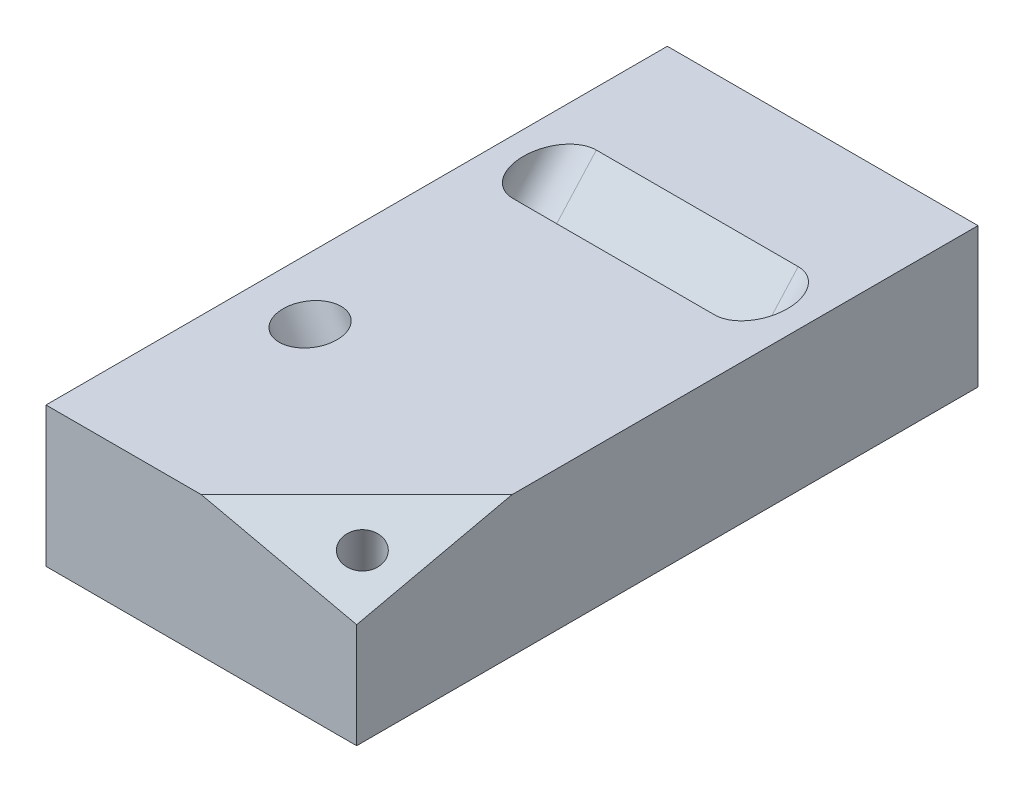
ISO-10303-21;
HEADER;
FILE_DESCRIPTION(('STEP AP214'),'2;1');
FILE_NAME('part.step','',(''),(''),'','','');
FILE_SCHEMA(('AUTOMOTIVE_DESIGN { 1 0 10303 214 1 1 1 1 }'));
ENDSEC;
DATA;
#1=APPLICATION_CONTEXT('core data for automotive mechanical design processes');
#2=APPLICATION_PROTOCOL_DEFINITION('international standard','automotive_design',2000,#1);
#3=PRODUCT_CONTEXT('',#1,'mechanical');
#4=PRODUCT('Part','Part','',(#3));
#5=PRODUCT_RELATED_PRODUCT_CATEGORY('part','',(#4));
#6=PRODUCT_DEFINITION_FORMATION('','',#4);
#7=PRODUCT_DEFINITION_CONTEXT('part definition',#1,'design');
#8=PRODUCT_DEFINITION('design','',#6,#7);
#9=PRODUCT_DEFINITION_SHAPE('','',#8);
#10=(LENGTH_UNIT() NAMED_UNIT(*) SI_UNIT(.MILLI.,.METRE.));
#11=(NAMED_UNIT(*) PLANE_ANGLE_UNIT() SI_UNIT($,.RADIAN.));
#12=(NAMED_UNIT(*) SI_UNIT($,.STERADIAN.) SOLID_ANGLE_UNIT());
#13=UNCERTAINTY_MEASURE_WITH_UNIT(LENGTH_MEASURE(1.E-05),#10,'distance_accuracy_value','');
#14=(GEOMETRIC_REPRESENTATION_CONTEXT(3) GLOBAL_UNCERTAINTY_ASSIGNED_CONTEXT((#13)) GLOBAL_UNIT_ASSIGNED_CONTEXT((#10,
#11,#12)) REPRESENTATION_CONTEXT('',''));
#15=CARTESIAN_POINT('',(0.,0.,0.));
#16=DIRECTION('',(0.,0.,1.));
#17=DIRECTION('',(1.,0.,0.));
#18=AXIS2_PLACEMENT_3D('',#15,#16,#17);
#19=CARTESIAN_POINT('',(100.,90.,200.));
#20=DIRECTION('',(-1.,0.,0.));
#21=DIRECTION('',(0.,0.,1.));
#22=AXIS2_PLACEMENT_3D('',#19,#20,#21);
#23=PLANE('',#22);
#24=DIRECTION('',(0.,-0.219512195121951,0.975609756097561));
#25=VECTOR('',#24,1.);
#26=CARTESIAN_POINT('',(99.9999999999999,90.0000000000001,100.));
#27=LINE('',#26,#25);
#28=CARTESIAN_POINT('',(100.,90.,100.));
#29=VERTEX_POINT('',#28);
#30=CARTESIAN_POINT('',(100.,67.5,200.));
#31=VERTEX_POINT('',#30);
#32=EDGE_CURVE('E170',#29,#31,#27,.T.);
#33=ORIENTED_EDGE('',*,*,#32,.T.);
#34=DIRECTION('',(0.,-1.,0.));
#35=VECTOR('',#34,1.);
#36=CARTESIAN_POINT('',(100.,90.,200.));
#37=LINE('',#36,#35);
#38=CARTESIAN_POINT('',(100.,0.,200.));
#39=VERTEX_POINT('',#38);
#40=EDGE_CURVE('E184',#31,#39,#37,.T.);
#41=ORIENTED_EDGE('',*,*,#40,.T.);
#42=DIRECTION('',(0.,0.,-1.));
#43=VECTOR('',#42,1.);
#44=CARTESIAN_POINT('',(100.,0.,200.));
#45=LINE('',#44,#43);
#46=CARTESIAN_POINT('',(100.,0.,-200.));
#47=VERTEX_POINT('',#46);
#48=EDGE_CURVE('E173',#39,#47,#45,.T.);
#49=ORIENTED_EDGE('',*,*,#48,.T.);
#50=DIRECTION('',(0.,-1.,0.));
#51=VECTOR('',#50,1.);
#52=CARTESIAN_POINT('',(100.,90.,-200.));
#53=LINE('',#52,#51);
#54=CARTESIAN_POINT('',(100.,90.,-200.));
#55=VERTEX_POINT('',#54);
#56=EDGE_CURVE('E111',#55,#47,#53,.T.);
#57=ORIENTED_EDGE('',*,*,#56,.F.);
#58=DIRECTION('',(0.,0.,-1.));
#59=VECTOR('',#58,1.);
#60=CARTESIAN_POINT('',(100.,90.,200.));
#61=LINE('',#60,#59);
#62=EDGE_CURVE('E174',#29,#55,#61,.T.);
#63=ORIENTED_EDGE('',*,*,#62,.F.);
#64=EDGE_LOOP('',(#33,#41,#49,#57,#63));
#65=FACE_BOUND('',#64,.T.);
#66=ADVANCED_FACE('F39',(#65),#23,.F.);
#67=CARTESIAN_POINT('',(-100.,90.,200.));
#68=DIRECTION('',(0.,0.,-1.));
#69=DIRECTION('',(-1.,0.,0.));
#70=AXIS2_PLACEMENT_3D('',#67,#68,#69);
#71=PLANE('',#70);
#72=DIRECTION('',(-0.975609756097561,0.219512195121951,0.));
#73=VECTOR('',#72,1.);
#74=CARTESIAN_POINT('',(100.,67.5,200.));
#75=LINE('',#74,#73);
#76=CARTESIAN_POINT('',(0.,90.,200.));
#77=VERTEX_POINT('',#76);
#78=EDGE_CURVE('E164',#31,#77,#75,.T.);
#79=ORIENTED_EDGE('',*,*,#78,.T.);
#80=DIRECTION('',(1.,0.,0.));
#81=VECTOR('',#80,1.);
#82=CARTESIAN_POINT('',(-100.,90.,200.));
#83=LINE('',#82,#81);
#84=CARTESIAN_POINT('',(-100.,90.,200.));
#85=VERTEX_POINT('',#84);
#86=EDGE_CURVE('E181',#85,#77,#83,.T.);
#87=ORIENTED_EDGE('',*,*,#86,.F.);
#88=DIRECTION('',(0.,-1.,0.));
#89=VECTOR('',#88,1.);
#90=CARTESIAN_POINT('',(-100.,90.,200.));
#91=LINE('',#90,#89);
#92=CARTESIAN_POINT('',(-100.,0.,200.));
#93=VERTEX_POINT('',#92);
#94=EDGE_CURVE('E194',#85,#93,#91,.T.);
#95=ORIENTED_EDGE('',*,*,#94,.T.);
#96=DIRECTION('',(1.,0.,0.));
#97=VECTOR('',#96,1.);
#98=CARTESIAN_POINT('',(-100.,0.,200.));
#99=LINE('',#98,#97);
#100=EDGE_CURVE('E177',#93,#39,#99,.T.);
#101=ORIENTED_EDGE('',*,*,#100,.T.);
#102=ORIENTED_EDGE('',*,*,#40,.F.);
#103=EDGE_LOOP('',(#79,#87,#95,#101,#102));
#104=FACE_BOUND('',#103,.T.);
#105=ADVANCED_FACE('F217',(#104),#71,.F.);
#106=CARTESIAN_POINT('',(0.,90.,0.));
#107=DIRECTION('',(0.,-1.,0.));
#108=DIRECTION('',(0.,0.,-1.));
#109=AXIS2_PLACEMENT_3D('',#106,#107,#108);
#110=PLANE('',#109);
#111=DIRECTION('',(1.,0.,0.));
#112=VECTOR('',#111,1.);
#113=CARTESIAN_POINT('',(0.,90.,-119.262036223617));
#114=LINE('',#113,#112);
#115=CARTESIAN_POINT('',(-65.,90.,-119.262036223617));
#116=VERTEX_POINT('',#115);
#117=CARTESIAN_POINT('',(65.,90.,-119.262036223617));
#118=VERTEX_POINT('',#117);
#119=EDGE_CURVE('E334',#116,#118,#114,.T.);
#120=ORIENTED_EDGE('',*,*,#119,.T.);
#121=CARTESIAN_POINT('',(65.,90.,-92.3493816314897));
#122=DIRECTION('',(0.,-1.,0.));
#123=DIRECTION('',(0.,0.,-1.));
#124=AXIS2_PLACEMENT_3D('',#121,#122,#123);
#125=ELLIPSE('',#124,26.9126545921276,20.);
#126=CARTESIAN_POINT('',(65.,90.,-65.4367270393622));
#127=VERTEX_POINT('',#126);
#128=EDGE_CURVE('E118',#118,#127,#125,.T.);
#129=ORIENTED_EDGE('',*,*,#128,.T.);
#130=DIRECTION('',(1.,0.,0.));
#131=VECTOR('',#130,1.);
#132=CARTESIAN_POINT('',(0.,90.,-65.4367270393622));
#133=LINE('',#132,#131);
#134=CARTESIAN_POINT('',(-65.,90.,-65.4367270393622));
#135=VERTEX_POINT('',#134);
#136=EDGE_CURVE('E339',#135,#127,#133,.T.);
#137=ORIENTED_EDGE('',*,*,#136,.F.);
#138=CARTESIAN_POINT('',(-65.,90.,-92.3493816314897));
#139=DIRECTION('',(0.,-1.,0.));
#140=DIRECTION('',(0.,0.,-1.));
#141=AXIS2_PLACEMENT_3D('',#138,#139,#140);
#142=ELLIPSE('',#141,26.9126545921276,20.);
#143=EDGE_CURVE('E330',#135,#116,#142,.T.);
#144=ORIENTED_EDGE('',*,*,#143,.T.);
#145=EDGE_LOOP('',(#120,#129,#137,#144));
#146=FACE_BOUND('',#145,.T.);
#147=CARTESIAN_POINT('',(-60.0000000000001,90.,50.));
#148=CARTESIAN_POINT('',(-59.7652053283955,90.,49.9999988452972));
#149=CARTESIAN_POINT('',(-59.5304306376043,90.,50.0055146076062));
#150=CARTESIAN_POINT('',(-59.0615251413032,90.,50.0275421938246));
#151=CARTESIAN_POINT('',(-58.827394063033,90.,50.0440482590427));
#152=CARTESIAN_POINT('',(-58.1742145812687,90.,50.1054922984556));
#153=CARTESIAN_POINT('',(-57.7562494179976,90.,50.1626027392273));
#154=CARTESIAN_POINT('',(-56.9263661175837,90.,50.311449284218));
#155=CARTESIAN_POINT('',(-56.514451274401,90.,50.4032035728577));
#156=CARTESIAN_POINT('',(-55.6947360998138,90.,50.6215348289774));
#157=CARTESIAN_POINT('',(-55.2870419531278,90.,50.7485105850292));
#158=CARTESIAN_POINT('',(-54.4833749418192,90.,51.0353387366216));
#159=CARTESIAN_POINT('',(-54.0874030686239,90.,51.1951939039475));
#160=CARTESIAN_POINT('',(-53.3089152512236,90.,51.5462999780631));
#161=CARTESIAN_POINT('',(-52.9264210727341,90.,51.7375990751777));
#162=CARTESIAN_POINT('',(-52.1775383867728,90.,52.1494673927575));
#163=CARTESIAN_POINT('',(-51.8111506781314,90.,52.3700380628252));
#164=CARTESIAN_POINT('',(-51.077908684671,90.,52.850348140272));
#165=CARTESIAN_POINT('',(-50.7119891563375,90.,53.111513959563));
#166=CARTESIAN_POINT('',(-50.001474934222,90.,53.661398042464));
#167=CARTESIAN_POINT('',(-49.6568818199419,90.,53.9501183428303));
#168=CARTESIAN_POINT('',(-48.9906809685199,90.,54.5522960289209));
#169=CARTESIAN_POINT('',(-48.6690510126073,90.,54.8657288677396));
#170=CARTESIAN_POINT('',(-48.0495002435389,90.,55.5150398933948));
#171=CARTESIAN_POINT('',(-47.7515744548936,90.,55.8509133425873));
#172=CARTESIAN_POINT('',(-47.1498502478439,90.,56.579455112673));
#173=CARTESIAN_POINT('',(-46.8487716314138,90.,56.9743711201159));
#174=CARTESIAN_POINT('',(-46.277282999022,90.,57.7856853967356));
#175=CARTESIAN_POINT('',(-46.0068695555349,90.,58.2020812574695));
#176=CARTESIAN_POINT('',(-45.4948454912646,90.,59.0574182573282));
#177=CARTESIAN_POINT('',(-45.253523096637,90.,59.4965317244831));
#178=CARTESIAN_POINT('',(-44.8028969813265,90.,60.3910501717807));
#179=CARTESIAN_POINT('',(-44.5936041903744,90.,60.8464606479712));
#180=CARTESIAN_POINT('',(-44.2072634663421,90.,61.771013985322));
#181=CARTESIAN_POINT('',(-44.0302318749787,90.,62.240163667113));
#182=CARTESIAN_POINT('',(-43.7086675069423,90.,63.189483469836));
#183=CARTESIAN_POINT('',(-43.5641375067785,90.,63.6696545284312));
#184=CARTESIAN_POINT('',(-43.2840661028775,90.,64.727765472262));
#185=CARTESIAN_POINT('',(-43.1550655241902,90.,65.3074461254432));
#186=CARTESIAN_POINT('',(-42.9428868136613,90.,66.4745926962538));
#187=CARTESIAN_POINT('',(-42.8596704965388,90.,67.0620517064322));
#188=CARTESIAN_POINT('',(-42.7388871794467,90.,68.2417418768135));
#189=CARTESIAN_POINT('',(-42.7013279339652,90.,68.8339738304734));
#190=CARTESIAN_POINT('',(-42.6718841854332,90.,70.0196922533776));
#191=CARTESIAN_POINT('',(-42.6800092424899,90.,70.6131789592206));
#192=CARTESIAN_POINT('',(-42.7419544708201,90.,71.7977424571735));
#193=CARTESIAN_POINT('',(-42.7957726863146,90.,72.3888193513413));
#194=CARTESIAN_POINT('',(-42.949095882727,90.,73.5649996637939));
#195=CARTESIAN_POINT('',(-43.0485985763027,90.,74.1501033796463));
#196=CARTESIAN_POINT('',(-43.2932814374751,90.,75.3107604988306));
#197=CARTESIAN_POINT('',(-43.4384661638352,90.,75.8863129429719));
#198=CARTESIAN_POINT('',(-43.7744933001938,90.,77.0241465328505));
#199=CARTESIAN_POINT('',(-43.9653490044202,90.,77.5864237618897));
#200=CARTESIAN_POINT('',(-44.3888201874786,90.,78.6838548759501));
#201=CARTESIAN_POINT('',(-44.6206537951476,90.,79.2193100751441));
#202=CARTESIAN_POINT('',(-45.1279208288465,90.,80.2691912430945));
#203=CARTESIAN_POINT('',(-45.4033525335809,90.,80.7836180410642));
#204=CARTESIAN_POINT('',(-45.9777405157709,90.,81.7540351404949));
#205=CARTESIAN_POINT('',(-46.2739618693368,90.,82.2116441308714));
#206=CARTESIAN_POINT('',(-46.9031629483718,90.,83.1006287039279));
#207=CARTESIAN_POINT('',(-47.2361262953167,90.,83.5320158436189));
#208=CARTESIAN_POINT('',(-47.9138103941635,90.,84.3361388994394));
#209=CARTESIAN_POINT('',(-48.2561656242023,90.,84.7108682647113));
#210=CARTESIAN_POINT('',(-48.9707347184547,90.,85.4307072749091));
#211=CARTESIAN_POINT('',(-49.3429458315239,90.,85.7758196429146));
#212=CARTESIAN_POINT('',(-50.0903823151189,90.,86.4114032220766));
#213=CARTESIAN_POINT('',(-50.4638250144253,90.,86.7039706690662));
#214=CARTESIAN_POINT('',(-51.2336546189204,90.,87.257139407959));
#215=CARTESIAN_POINT('',(-51.6300380225035,90.,87.5177455595044));
#216=CARTESIAN_POINT('',(-52.4209586869913,90.,87.9905622749516));
#217=CARTESIAN_POINT('',(-52.8143672358095,90.,88.2046607528793));
#218=CARTESIAN_POINT('',(-53.6175330844787,90.,88.5994453787394));
#219=CARTESIAN_POINT('',(-54.0272864936262,90.,88.7801394211842));
#220=CARTESIAN_POINT('',(-54.8431659464039,90.,89.0992043165133));
#221=CARTESIAN_POINT('',(-55.2487213604421,90.,89.2390341523805));
#222=CARTESIAN_POINT('',(-56.0703468463312,90.,89.4846265433299));
#223=CARTESIAN_POINT('',(-56.4864239340249,90.0000000000001,89.5903656843326));
#224=CARTESIAN_POINT('',(-57.3212893445125,90.0000000000001,89.7653727072141));
#225=CARTESIAN_POINT('',(-57.7399942149525,90.,89.8350383297135));
#226=CARTESIAN_POINT('',(-58.581939356568,90.,89.9388530625604));
#227=CARTESIAN_POINT('',(-59.0051811343312,90.,89.9729899808278));
#228=CARTESIAN_POINT('',(-59.8535748444583,90.,90.0052968321121));
#229=CARTESIAN_POINT('',(-60.2787285178289,90.,90.0034211287037));
#230=CARTESIAN_POINT('',(-61.1272974604698,90.,89.9636168059096));
#231=CARTESIAN_POINT('',(-61.5507129069006,90.,89.925691957137));
#232=CARTESIAN_POINT('',(-62.3914695275698,90.,89.8144506274045));
#233=CARTESIAN_POINT('',(-62.8088258878297,90.,89.7412486818732));
#234=CARTESIAN_POINT('',(-63.6360319309605,90.,89.5603850025502));
#235=CARTESIAN_POINT('',(-64.0458809067137,90.,89.4527200401661));
#236=CARTESIAN_POINT('',(-64.8548735112772,90.,89.2043460854379));
#237=CARTESIAN_POINT('',(-65.254029639864,90.,89.0636777361914));
#238=CARTESIAN_POINT('',(-66.0396431778818,90.,88.750833663402));
#239=CARTESIAN_POINT('',(-66.4261041570811,90.,88.578666887969));
#240=CARTESIAN_POINT('',(-67.1910519234975,90.,88.2012753590861));
#241=CARTESIAN_POINT('',(-67.5692761202084,90.,87.9955189533775));
#242=CARTESIAN_POINT('',(-68.3085079293332,90.,87.5553080166032));
#243=CARTESIAN_POINT('',(-68.6695188195047,90.,87.3208589797591));
#244=CARTESIAN_POINT('',(-69.3762271530275,90.,86.8229753792021));
#245=CARTESIAN_POINT('',(-69.7217409101227,90.,86.5592804266927));
#246=CARTESIAN_POINT('',(-70.3924163300243,90.,86.0069736522419));
#247=CARTESIAN_POINT('',(-70.7175706844407,90.,85.7183529701983));
#248=CARTESIAN_POINT('',(-71.3464990476752,90.,85.118353015349));
#249=CARTESIAN_POINT('',(-71.6502601785092,90.,84.8069602605603));
#250=CARTESIAN_POINT('',(-72.2353608810002,90.,84.1637630443636));
#251=CARTESIAN_POINT('',(-72.5166981884357,90.,83.8319565276766));
#252=CARTESIAN_POINT('',(-73.0980628566826,90.,83.0972801980343));
#253=CARTESIAN_POINT('',(-73.3942422101112,90.,82.6913606623502));
#254=CARTESIAN_POINT('',(-73.9547963648439,90.,81.8587266189492));
#255=CARTESIAN_POINT('',(-74.2192002055038,90.,81.4320316067507));
#256=CARTESIAN_POINT('',(-74.7160152219459,90.,80.5604916128314));
#257=CARTESIAN_POINT('',(-74.9484301924193,90.,80.115648792031));
#258=CARTESIAN_POINT('',(-75.3810442719969,90.,79.2104295740401));
#259=CARTESIAN_POINT('',(-75.5812325653466,90.,78.7500480242672));
#260=CARTESIAN_POINT('',(-75.9927227406751,90.,77.7058082361404));
#261=CARTESIAN_POINT('',(-76.1954176356903,90.,77.1185412713255));
#262=CARTESIAN_POINT('',(-76.550941439348,90.,75.9288578286583));
#263=CARTESIAN_POINT('',(-76.7037457486539,90.,75.3264340346852));
#264=CARTESIAN_POINT('',(-76.9592284205133,90.,74.1113743388705));
#265=CARTESIAN_POINT('',(-77.0619315037063,90.,73.498743627896));
#266=CARTESIAN_POINT('',(-77.2172874383968,90.,72.2672658207651));
#267=CARTESIAN_POINT('',(-77.2699467976985,90.,71.6484195434759));
#268=CARTESIAN_POINT('',(-77.3252374570808,90.,70.4085122745555));
#269=CARTESIAN_POINT('',(-77.3278697125436,90.,69.787451325445));
#270=CARTESIAN_POINT('',(-77.2831083121336,90.,68.5471357426293));
#271=CARTESIAN_POINT('',(-77.2357150643711,90.,67.9278810942296));
#272=CARTESIAN_POINT('',(-77.0908781405753,90.,66.6950070436764));
#273=CARTESIAN_POINT('',(-76.9934157931142,90.,66.081389830749));
#274=CARTESIAN_POINT('',(-76.7485049683716,90.,64.864492622782));
#275=CARTESIAN_POINT('',(-76.6010806560502,90.,64.261207778226));
#276=CARTESIAN_POINT('',(-76.2619099069974,90.,63.0884081703043));
#277=CARTESIAN_POINT('',(-76.0717569012247,90.,62.5184328222461));
#278=CARTESIAN_POINT('',(-75.6448607313489,90.,61.3961217504185));
#279=CARTESIAN_POINT('',(-75.4081157363628,90.,60.8437867208364));
#280=CARTESIAN_POINT('',(-74.9038288090781,90.,59.7934645366025));
#281=CARTESIAN_POINT('',(-74.6389516797555,90.,59.294197982421));
#282=CARTESIAN_POINT('',(-74.0688728063608,90.,58.3194724577631));
#283=CARTESIAN_POINT('',(-73.7636894521788,90.,57.8440027654768));
#284=CARTESIAN_POINT('',(-73.1356041634943,90.,56.9520503353424));
#285=CARTESIAN_POINT('',(-72.8152811620761,90.,56.5337516765975));
#286=CARTESIAN_POINT('',(-72.141104226953,90.,55.7250916946355));
#287=CARTESIAN_POINT('',(-71.7872535364096,90.,55.3347276756762));
#288=CARTESIAN_POINT('',(-71.0724675879108,90.,54.6112262897382));
#289=CARTESIAN_POINT('',(-70.7136437731973,90.,54.2760030475195));
#290=CARTESIAN_POINT('',(-69.9694810005794,90.,53.6364427792518));
#291=CARTESIAN_POINT('',(-69.5841463516714,90.,53.3321007536649));
#292=CARTESIAN_POINT('',(-68.813211876941,90.,52.7751658005505));
#293=CARTESIAN_POINT('',(-68.4290780278664,90.,52.5205437440852));
#294=CARTESIAN_POINT('',(-67.641090726467,90.,52.0440751375838));
#295=CARTESIAN_POINT('',(-67.2372429298184,90.,51.822219260029));
#296=CARTESIAN_POINT('',(-66.4327070529351,90.,51.4239516017289));
#297=CARTESIAN_POINT('',(-66.0328683552507,90.,51.2458236640911));
#298=CARTESIAN_POINT('',(-65.2194086743483,90.,50.9232143834853));
#299=CARTESIAN_POINT('',(-64.8057766243922,90.,50.7787608387121));
#300=CARTESIAN_POINT('',(-64.031658005488,90.,50.5447331938309));
#301=CARTESIAN_POINT('',(-63.672677450732,90.,50.4501507379123));
#302=CARTESIAN_POINT('',(-62.9486535498927,90.,50.2873484795657));
#303=CARTESIAN_POINT('',(-62.5836084546363,90.,50.2191364257358));
#304=CARTESIAN_POINT('',(-61.849746392029,90.,50.1097932608259));
#305=CARTESIAN_POINT('',(-61.480932189366,90.,50.0686435702482));
#306=CARTESIAN_POINT('',(-60.7413948158697,90.,50.0137535836262));
#307=CARTESIAN_POINT('',(-60.3706725086171,90.,50.00000182294));
#308=CARTESIAN_POINT('',(-60.0000000000001,90.,50.));
#309=B_SPLINE_CURVE_WITH_KNOTS('',3,(#147,#148,#149,#150,#151,#152,#153,#154,#155,#156,#157,
#158,#159,#160,#161,#162,#163,#164,#165,#166,#167,#168,#169,#170,#171,#172,#173,#174,#175,#176,
#177,#178,#179,#180,#181,#182,#183,#184,#185,#186,#187,#188,#189,#190,#191,#192,#193,#194,#195,
#196,#197,#198,#199,#200,#201,#202,#203,#204,#205,#206,#207,#208,#209,#210,#211,#212,#213,#214,
#215,#216,#217,#218,#219,#220,#221,#222,#223,#224,#225,#226,#227,#228,#229,#230,#231,#232,#233,
#234,#235,#236,#237,#238,#239,#240,#241,#242,#243,#244,#245,#246,#247,#248,#249,#250,#251,#252,
#253,#254,#255,#256,#257,#258,#259,#260,#261,#262,#263,#264,#265,#266,#267,#268,#269,#270,#271,
#272,#273,#274,#275,#276,#277,#278,#279,#280,#281,#282,#283,#284,#285,#286,#287,#288,#289,#290,
#291,#292,#293,#294,#295,#296,#297,#298,#299,#300,#301,#302,#303,#304,#305,#306,#307,#308),
.UNSPECIFIED.,.T.,.F.,(4,2,2,2,2,2,2,2,2,2,2,2,2,2,2,2,2,2,2,2,2,2,2,2,2,2,2,2,2,2,2,2,2,2,2,2,
2,2,2,2,2,2,2,2,2,2,2,2,2,2,2,2,2,2,2,2,2,2,2,2,2,2,2,2,2,2,2,2,2,2,2,2,2,2,2,2,2,2,2,2,4),(0.,
0.70427754607296,1.40818635538272,2.67213748356031,3.93675297915549,5.21631637396286,
6.49598768218688,7.77763879444036,9.05935340100595,10.4066288679982,11.7540039993707,
13.1000572507397,14.4458272169239,15.9341267406679,17.4222597490314,18.9240991046956,
20.4264498083553,21.9295594161566,23.4327973811715,25.212479156842,26.9906743721993,
28.7691715575998,30.5480409333436,32.3268341729591,34.1055383612029,35.8844201086354,
37.6638202966489,39.4123520395183,41.160814765858,42.7943899860214,44.4272399247728,
45.9483024863577,47.4692250465188,48.8908697132445,50.3122979534425,51.6544933123456,
52.996371061878,54.2818823668264,55.56827471158,56.8401641401555,58.1124898883347,
59.3864280774982,60.6602330318876,61.9299298590439,63.1997456698055,64.4680058572234,
65.7359063136657,67.0262704376852,68.3163878612028,69.6190874819109,70.9222520814407,
72.2261945522915,73.5302685209724,75.0362041899935,76.540752959964,78.0451230981855,
79.5499970776307,81.4114638738476,83.2738471142808,85.1353104972038,86.9965317778876,
88.8577175142572,90.7188880671083,92.5807531793673,94.4417190508314,96.2422986568354,
98.0429490327116,99.7366363961973,101.429553659917,103.008416455514,104.587126682006,
106.058670995054,107.529976689921,108.911037063623,110.291703531179,111.603420223598,
112.916215933093,114.0289691791,115.142049145043,116.254364132876,117.366213575546),.UNSPECIFIED.);
#310=CARTESIAN_POINT('',(-60.0000000000001,90.,50.));
#311=VERTEX_POINT('',#310);
#312=EDGE_CURVE('E129',#311,#311,#309,.T.);
#313=ORIENTED_EDGE('',*,*,#312,.T.);
#314=EDGE_LOOP('',(#313));
#315=FACE_BOUND('',#314,.T.);
#316=DIRECTION('',(0.707106781186547,0.,-0.707106781186548));
#317=VECTOR('',#316,1.);
#318=CARTESIAN_POINT('',(0.,90.,200.));
#319=LINE('',#318,#317);
#320=EDGE_CURVE('E167',#77,#29,#319,.T.);
#321=ORIENTED_EDGE('',*,*,#320,.T.);
#322=ORIENTED_EDGE('',*,*,#62,.T.);
#323=DIRECTION('',(-1.,0.,0.));
#324=VECTOR('',#323,1.);
#325=CARTESIAN_POINT('',(-100.,90.,-200.));
#326=LINE('',#325,#324);
#327=CARTESIAN_POINT('',(-100.,90.,-200.));
#328=VERTEX_POINT('',#327);
#329=EDGE_CURVE('E176',#55,#328,#326,.T.);
#330=ORIENTED_EDGE('',*,*,#329,.T.);
#331=DIRECTION('',(0.,0.,1.));
#332=VECTOR('',#331,1.);
#333=CARTESIAN_POINT('',(-100.,90.,200.));
#334=LINE('',#333,#332);
#335=EDGE_CURVE('E179',#328,#85,#334,.T.);
#336=ORIENTED_EDGE('',*,*,#335,.T.);
#337=ORIENTED_EDGE('',*,*,#86,.T.);
#338=EDGE_LOOP('',(#321,#322,#330,#336,#337));
#339=FACE_BOUND('',#338,.T.);
#340=ADVANCED_FACE('F140',(#146,#315,#339),#110,.F.);
#341=CARTESIAN_POINT('',(-100.,90.,-200.));
#342=DIRECTION('',(0.,0.,1.));
#343=DIRECTION('',(1.,0.,0.));
#344=AXIS2_PLACEMENT_3D('',#341,#342,#343);
#345=PLANE('',#344);
#346=DIRECTION('',(-1.,0.,0.));
#347=VECTOR('',#346,1.);
#348=CARTESIAN_POINT('',(-100.,0.,-200.));
#349=LINE('',#348,#347);
#350=CARTESIAN_POINT('',(-100.,0.,-200.));
#351=VERTEX_POINT('',#350);
#352=EDGE_CURVE('E187',#47,#351,#349,.T.);
#353=ORIENTED_EDGE('',*,*,#352,.T.);
#354=DIRECTION('',(0.,-1.,0.));
#355=VECTOR('',#354,1.);
#356=CARTESIAN_POINT('',(-100.,90.,-200.));
#357=LINE('',#356,#355);
#358=EDGE_CURVE('E196',#328,#351,#357,.T.);
#359=ORIENTED_EDGE('',*,*,#358,.F.);
#360=ORIENTED_EDGE('',*,*,#329,.F.);
#361=ORIENTED_EDGE('',*,*,#56,.T.);
#362=EDGE_LOOP('',(#353,#359,#360,#361));
#363=FACE_BOUND('',#362,.T.);
#364=ADVANCED_FACE('F206',(#363),#345,.F.);
#365=CARTESIAN_POINT('',(-100.,90.,200.));
#366=DIRECTION('',(1.,0.,0.));
#367=DIRECTION('',(0.,0.,-1.));
#368=AXIS2_PLACEMENT_3D('',#365,#366,#367);
#369=PLANE('',#368);
#370=DIRECTION('',(0.,0.,1.));
#371=VECTOR('',#370,1.);
#372=CARTESIAN_POINT('',(-100.,0.,200.));
#373=LINE('',#372,#371);
#374=EDGE_CURVE('E189',#351,#93,#373,.T.);
#375=ORIENTED_EDGE('',*,*,#374,.T.);
#376=ORIENTED_EDGE('',*,*,#94,.F.);
#377=ORIENTED_EDGE('',*,*,#335,.F.);
#378=ORIENTED_EDGE('',*,*,#358,.T.);
#379=EDGE_LOOP('',(#375,#376,#377,#378));
#380=FACE_BOUND('',#379,.T.);
#381=ADVANCED_FACE('F214',(#380),#369,.F.);
#382=CARTESIAN_POINT('',(0.,0.,0.));
#383=DIRECTION('',(0.,-1.,0.));
#384=DIRECTION('',(0.,0.,-1.));
#385=AXIS2_PLACEMENT_3D('',#382,#383,#384);
#386=PLANE('',#385);
#387=CARTESIAN_POINT('',(65.,0.,-11.3130176446839));
#388=DIRECTION('',(0.,-1.,0.));
#389=DIRECTION('',(0.,0.,-1.));
#390=AXIS2_PLACEMENT_3D('',#387,#388,#389);
#391=ELLIPSE('',#390,26.9126545921276,20.);
#392=CARTESIAN_POINT('',(65.,0.,-38.2256722368114));
#393=VERTEX_POINT('',#392);
#394=CARTESIAN_POINT('',(65.,0.,15.5996369474437));
#395=VERTEX_POINT('',#394);
#396=EDGE_CURVE('E11',#393,#395,#391,.T.);
#397=ORIENTED_EDGE('',*,*,#396,.F.);
#398=DIRECTION('',(1.,0.,0.));
#399=VECTOR('',#398,1.);
#400=CARTESIAN_POINT('',(0.,0.,-38.2256722368114));
#401=LINE('',#400,#399);
#402=CARTESIAN_POINT('',(-65.,0.,-38.2256722368114));
#403=VERTEX_POINT('',#402);
#404=EDGE_CURVE('E105',#403,#393,#401,.T.);
#405=ORIENTED_EDGE('',*,*,#404,.F.);
#406=CARTESIAN_POINT('',(-65.,0.,-11.3130176446838));
#407=DIRECTION('',(0.,-1.,0.));
#408=DIRECTION('',(0.,0.,-1.));
#409=AXIS2_PLACEMENT_3D('',#406,#407,#408);
#410=ELLIPSE('',#409,26.9126545921276,20.);
#411=CARTESIAN_POINT('',(-65.,0.,15.5996369474437));
#412=VERTEX_POINT('',#411);
#413=EDGE_CURVE('E110',#412,#403,#410,.T.);
#414=ORIENTED_EDGE('',*,*,#413,.F.);
#415=DIRECTION('',(1.,0.,0.));
#416=VECTOR('',#415,1.);
#417=CARTESIAN_POINT('',(0.,0.,15.5996369474437));
#418=LINE('',#417,#416);
#419=EDGE_CURVE('E46',#412,#395,#418,.T.);
#420=ORIENTED_EDGE('',*,*,#419,.T.);
#421=EDGE_LOOP('',(#397,#405,#414,#420));
#422=FACE_BOUND('',#421,.T.);
#423=CARTESIAN_POINT('',(55.1744586259158,0.,151.5));
#424=DIRECTION('',(0.,-1.,0.));
#425=DIRECTION('',(0.707106781186548,0.,0.707106781186548));
#426=AXIS2_PLACEMENT_3D('',#423,#424,#425);
#427=ELLIPSE('',#426,12.3971390242105,11.8134979643054);
#428=CARTESIAN_POINT('',(63.9405596972474,0.,160.266101071332));
#429=VERTEX_POINT('',#428);
#430=EDGE_CURVE('E161',#429,#429,#427,.F.);
#431=ORIENTED_EDGE('',*,*,#430,.T.);
#432=EDGE_LOOP('',(#431));
#433=FACE_BOUND('',#432,.T.);
#434=ORIENTED_EDGE('',*,*,#48,.F.);
#435=ORIENTED_EDGE('',*,*,#100,.F.);
#436=ORIENTED_EDGE('',*,*,#374,.F.);
#437=ORIENTED_EDGE('',*,*,#352,.F.);
#438=EDGE_LOOP('',(#434,#435,#436,#437));
#439=FACE_BOUND('',#438,.T.);
#440=ADVANCED_FACE('F122',(#422,#433,#439),#386,.T.);
#441=CARTESIAN_POINT('',(27.5822928490352,122.587968217934,27.5822928490352));
#442=DIRECTION('',(0.214407294842609,0.952921310411594,0.214407294842609));
#443=DIRECTION('',(0.,-0.219512195121951,0.975609756097561));
#444=AXIS2_PLACEMENT_3D('',#441,#442,#443);
#445=PLANE('',#444);
#446=CARTESIAN_POINT('',(73.2558257378913,80.36163160878,169.581367111976));
#447=DIRECTION('',(-0.214407294842609,-0.952921310411594,-0.214407294842609));
#448=DIRECTION('',(0.,0.219512195121951,-0.975609756097561));
#449=AXIS2_PLACEMENT_3D('',#446,#447,#448);
#450=CIRCLE('',#449,11.8134979643054);
#451=CARTESIAN_POINT('',(73.2558257378913,82.9548384789934,158.056003244361));
#452=VERTEX_POINT('',#451);
#453=EDGE_CURVE('E137',#452,#452,#450,.T.);
#454=ORIENTED_EDGE('',*,*,#453,.T.);
#455=EDGE_LOOP('',(#454));
#456=FACE_BOUND('',#455,.T.);
#457=ORIENTED_EDGE('',*,*,#78,.F.);
#458=ORIENTED_EDGE('',*,*,#32,.F.);
#459=ORIENTED_EDGE('',*,*,#320,.F.);
#460=EDGE_LOOP('',(#457,#458,#459));
#461=FACE_BOUND('',#460,.T.);
#462=ADVANCED_FACE('F220',(#456,#461),#445,.T.);
#463=CARTESIAN_POINT('',(31.8823864643385,-103.520320718121,128.207927838423));
#464=DIRECTION('',(0.214407294842609,0.952921310411594,0.214407294842609));
#465=DIRECTION('',(0.,-0.219512195121951,0.975609756097561));
#466=AXIS2_PLACEMENT_3D('',#463,#464,#465);
#467=CYLINDRICAL_SURFACE('',#466,11.8134979643054);
#468=ORIENTED_EDGE('',*,*,#430,.F.);
#469=EDGE_LOOP('',(#468));
#470=FACE_BOUND('',#469,.T.);
#471=ORIENTED_EDGE('',*,*,#453,.F.);
#472=EDGE_LOOP('',(#471));
#473=FACE_BOUND('',#472,.T.);
#474=ADVANCED_FACE('F151',(#470,#473),#467,.F.);
#475=CARTESIAN_POINT('',(-20.,20.717967697245,70.));
#476=DIRECTION('',(-0.500000000000001,0.866025403784438,0.));
#477=DIRECTION('',(0.,0.,-1.));
#478=AXIS2_PLACEMENT_3D('',#475,#476,#477);
#479=ELLIPSE('',#478,20.,15.);
#480=DIRECTION('',(-0.500000000000001,0.866025403784438,0.));
#481=VECTOR('',#480,1.);
#482=SURFACE_OF_LINEAR_EXTRUSION('',#479,#481);
#483=CARTESIAN_POINT('',(-20.,20.717967697245,50.));
#484=VERTEX_POINT('',#483);
#485=EDGE_CURVE('E138',#484,#484,#479,.T.);
#486=ORIENTED_EDGE('',*,*,#485,.F.);
#487=EDGE_LOOP('',(#486));
#488=FACE_BOUND('',#487,.T.);
#489=ORIENTED_EDGE('',*,*,#312,.F.);
#490=EDGE_LOOP('',(#489));
#491=FACE_BOUND('',#490,.T.);
#492=ADVANCED_FACE('F144',(#488,#491),#482,.F.);
#493=CARTESIAN_POINT('',(-20.,20.717967697245,70.));
#494=DIRECTION('',(-0.500000000000001,0.866025403784438,0.));
#495=DIRECTION('',(-0.866025403784438,-0.500000000000001,0.));
#496=AXIS2_PLACEMENT_3D('',#493,#494,#495);
#497=PLANE('',#496);
#498=ORIENTED_EDGE('',*,*,#485,.T.);
#499=EDGE_LOOP('',(#498));
#500=FACE_BOUND('',#499,.T.);
#501=ADVANCED_FACE('F150',(#500),#497,.T.);
#502=CARTESIAN_POINT('',(65.,-105.07771141199,83.2993786762338));
#503=DIRECTION('',(0.,0.743144825477393,-0.669130606358859));
#504=DIRECTION('',(0.,0.669130606358859,0.743144825477393));
#505=AXIS2_PLACEMENT_3D('',#502,#503,#504);
#506=CYLINDRICAL_SURFACE('',#505,20.);
#507=DIRECTION('',(0.,0.743144825477393,-0.669130606358859));
#508=VECTOR('',#507,1.);
#509=CARTESIAN_POINT('',(65.,-118.460323539168,68.436482166686));
#510=LINE('',#509,#508);
#511=EDGE_CURVE('E53',#393,#118,#510,.T.);
#512=ORIENTED_EDGE('',*,*,#511,.F.);
#513=ORIENTED_EDGE('',*,*,#396,.T.);
#514=DIRECTION('',(0.,0.743144825477393,-0.669130606358859));
#515=VECTOR('',#514,1.);
#516=CARTESIAN_POINT('',(65.,-91.6950992848132,98.1622751857817));
#517=LINE('',#516,#515);
#518=EDGE_CURVE('E332',#395,#127,#517,.T.);
#519=ORIENTED_EDGE('',*,*,#518,.T.);
#520=ORIENTED_EDGE('',*,*,#128,.F.);
#521=EDGE_LOOP('',(#512,#513,#519,#520));
#522=FACE_BOUND('',#521,.T.);
#523=ADVANCED_FACE('F114',(#522),#506,.F.);
#524=CARTESIAN_POINT('',(65.,-91.6950992848132,98.1622751857817));
#525=DIRECTION('',(0.,-0.669130606358859,-0.743144825477393));
#526=DIRECTION('',(0.,0.743144825477393,-0.669130606358859));
#527=AXIS2_PLACEMENT_3D('',#524,#525,#526);
#528=PLANE('',#527);
#529=ORIENTED_EDGE('',*,*,#136,.T.);
#530=ORIENTED_EDGE('',*,*,#518,.F.);
#531=ORIENTED_EDGE('',*,*,#419,.F.);
#532=DIRECTION('',(0.,0.743144825477393,-0.669130606358859));
#533=VECTOR('',#532,1.);
#534=CARTESIAN_POINT('',(-65.,-91.6950992848132,98.1622751857817));
#535=LINE('',#534,#533);
#536=EDGE_CURVE('E328',#412,#135,#535,.T.);
#537=ORIENTED_EDGE('',*,*,#536,.T.);
#538=EDGE_LOOP('',(#529,#530,#531,#537));
#539=FACE_BOUND('',#538,.T.);
#540=ADVANCED_FACE('F300',(#539),#528,.T.);
#541=CARTESIAN_POINT('',(-65.,-105.07771141199,83.2993786762338));
#542=DIRECTION('',(0.,0.743144825477393,-0.669130606358859));
#543=DIRECTION('',(0.,0.669130606358859,0.743144825477393));
#544=AXIS2_PLACEMENT_3D('',#541,#542,#543);
#545=CYLINDRICAL_SURFACE('',#544,20.);
#546=ORIENTED_EDGE('',*,*,#536,.F.);
#547=ORIENTED_EDGE('',*,*,#413,.T.);
#548=DIRECTION('',(0.,0.743144825477393,-0.669130606358859));
#549=VECTOR('',#548,1.);
#550=CARTESIAN_POINT('',(-65.,-118.460323539168,68.436482166686));
#551=LINE('',#550,#549);
#552=EDGE_CURVE('E58',#403,#116,#551,.T.);
#553=ORIENTED_EDGE('',*,*,#552,.T.);
#554=ORIENTED_EDGE('',*,*,#143,.F.);
#555=EDGE_LOOP('',(#546,#547,#553,#554));
#556=FACE_BOUND('',#555,.T.);
#557=ADVANCED_FACE('F308',(#556),#545,.F.);
#558=CARTESIAN_POINT('',(65.,-118.460323539168,68.436482166686));
#559=DIRECTION('',(0.,-0.669130606358859,-0.743144825477393));
#560=DIRECTION('',(0.,0.743144825477393,-0.669130606358859));
#561=AXIS2_PLACEMENT_3D('',#558,#559,#560);
#562=PLANE('',#561);
#563=ORIENTED_EDGE('',*,*,#552,.F.);
#564=ORIENTED_EDGE('',*,*,#404,.T.);
#565=ORIENTED_EDGE('',*,*,#511,.T.);
#566=ORIENTED_EDGE('',*,*,#119,.F.);
#567=EDGE_LOOP('',(#563,#564,#565,#566));
#568=FACE_BOUND('',#567,.T.);
#569=ADVANCED_FACE('F106',(#568),#562,.F.);
#570=CLOSED_SHELL('',(#66,#105,#340,#364,#381,#440,#462,#474,#492,#501,#523,#540,#557,#569));
#571=MANIFOLD_SOLID_BREP('B2',#570);
#572=ADVANCED_BREP_SHAPE_REPRESENTATION('',(#18,#571),#14);
#573=SHAPE_DEFINITION_REPRESENTATION(#9,#572);
ENDSEC;
END-ISO-10303-21;
